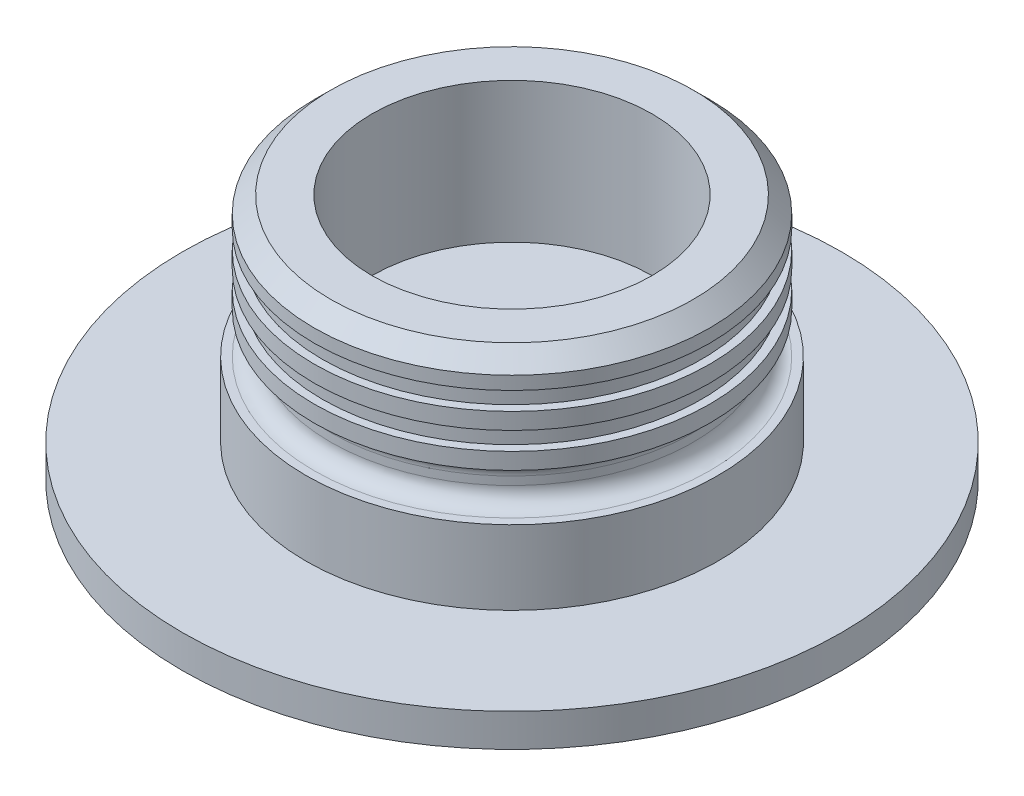
ISO-10303-21;
HEADER;
FILE_DESCRIPTION(('STEP AP214'),'2;1');
FILE_NAME('part.step','',(''),(''),'','','');
FILE_SCHEMA(('AUTOMOTIVE_DESIGN { 1 0 10303 214 1 1 1 1 }'));
ENDSEC;
DATA;
#1=APPLICATION_CONTEXT('core data for automotive mechanical design processes');
#2=APPLICATION_PROTOCOL_DEFINITION('international standard','automotive_design',2000,#1);
#3=PRODUCT_CONTEXT('',#1,'mechanical');
#4=PRODUCT('Part','Part','',(#3));
#5=PRODUCT_RELATED_PRODUCT_CATEGORY('part','',(#4));
#6=PRODUCT_DEFINITION_FORMATION('','',#4);
#7=PRODUCT_DEFINITION_CONTEXT('part definition',#1,'design');
#8=PRODUCT_DEFINITION('design','',#6,#7);
#9=PRODUCT_DEFINITION_SHAPE('','',#8);
#10=(LENGTH_UNIT() NAMED_UNIT(*) SI_UNIT(.MILLI.,.METRE.));
#11=(NAMED_UNIT(*) PLANE_ANGLE_UNIT() SI_UNIT($,.RADIAN.));
#12=(NAMED_UNIT(*) SI_UNIT($,.STERADIAN.) SOLID_ANGLE_UNIT());
#13=UNCERTAINTY_MEASURE_WITH_UNIT(LENGTH_MEASURE(1.E-05),#10,'distance_accuracy_value','');
#14=(GEOMETRIC_REPRESENTATION_CONTEXT(3) GLOBAL_UNCERTAINTY_ASSIGNED_CONTEXT((#13)) GLOBAL_UNIT_ASSIGNED_CONTEXT((#10,
#11,#12)) REPRESENTATION_CONTEXT('',''));
#15=CARTESIAN_POINT('',(0.,0.,0.));
#16=DIRECTION('',(0.,0.,1.));
#17=DIRECTION('',(1.,0.,0.));
#18=AXIS2_PLACEMENT_3D('',#15,#16,#17);
#19=CARTESIAN_POINT('',(0.,30.,0.));
#20=DIRECTION('',(0.,-1.,0.));
#21=DIRECTION('',(0.,0.,-1.));
#22=AXIS2_PLACEMENT_3D('',#19,#20,#21);
#23=CYLINDRICAL_SURFACE('',#22,24.);
#24=CARTESIAN_POINT('',(0.,28.,0.));
#25=DIRECTION('',(0.,1.,0.));
#26=DIRECTION('',(0.,0.,1.));
#27=AXIS2_PLACEMENT_3D('',#24,#25,#26);
#28=CIRCLE('',#27,24.);
#29=CARTESIAN_POINT('',(0.,28.,24.));
#30=VERTEX_POINT('',#29);
#31=EDGE_CURVE('E56',#30,#30,#28,.F.);
#32=ORIENTED_EDGE('',*,*,#31,.T.);
#33=EDGE_LOOP('',(#32));
#34=FACE_BOUND('',#33,.T.);
#35=CARTESIAN_POINT('',(0.,26.4,0.));
#36=DIRECTION('',(0.,-1.,0.));
#37=DIRECTION('',(0.,0.,-1.));
#38=AXIS2_PLACEMENT_3D('',#35,#36,#37);
#39=CIRCLE('',#38,24.);
#40=CARTESIAN_POINT('',(0.,26.4,-24.));
#41=VERTEX_POINT('',#40);
#42=EDGE_CURVE('E101',#41,#41,#39,.T.);
#43=ORIENTED_EDGE('',*,*,#42,.F.);
#44=EDGE_LOOP('',(#43));
#45=FACE_BOUND('',#44,.T.);
#46=ADVANCED_FACE('F41',(#34,#45),#23,.T.);
#47=CARTESIAN_POINT('',(0.,18.,0.));
#48=DIRECTION('',(0.,1.,0.));
#49=DIRECTION('',(0.,0.,1.));
#50=AXIS2_PLACEMENT_3D('',#47,#48,#49);
#51=CIRCLE('',#50,24.);
#52=CARTESIAN_POINT('',(0.,18.,24.));
#53=VERTEX_POINT('',#52);
#54=EDGE_CURVE('E89',#53,#53,#51,.T.);
#55=ORIENTED_EDGE('',*,*,#54,.T.);
#56=EDGE_LOOP('',(#55));
#57=FACE_BOUND('',#56,.T.);
#58=CARTESIAN_POINT('',(0.,20.,0.));
#59=DIRECTION('',(0.,-1.,0.));
#60=DIRECTION('',(0.,0.,-1.));
#61=AXIS2_PLACEMENT_3D('',#58,#59,#60);
#62=CIRCLE('',#61,24.);
#63=CARTESIAN_POINT('',(0.,20.,-24.));
#64=VERTEX_POINT('',#63);
#65=EDGE_CURVE('E98',#64,#64,#62,.T.);
#66=ORIENTED_EDGE('',*,*,#65,.T.);
#67=EDGE_LOOP('',(#66));
#68=FACE_BOUND('',#67,.T.);
#69=ADVANCED_FACE('F126',(#57,#68),#23,.T.);
#70=CARTESIAN_POINT('',(0.,13.,0.));
#71=DIRECTION('',(0.,1.,0.));
#72=DIRECTION('',(0.,0.,1.));
#73=AXIS2_PLACEMENT_3D('',#70,#71,#72);
#74=PLANE('',#73);
#75=CARTESIAN_POINT('',(0.,13.,0.));
#76=DIRECTION('',(0.,1.,0.));
#77=DIRECTION('',(0.,0.,1.));
#78=AXIS2_PLACEMENT_3D('',#75,#76,#77);
#79=CIRCLE('',#78,6.1);
#80=CARTESIAN_POINT('',(0.,13.,6.1));
#81=VERTEX_POINT('',#80);
#82=EDGE_CURVE('E85',#81,#81,#79,.T.);
#83=ORIENTED_EDGE('',*,*,#82,.F.);
#84=EDGE_LOOP('',(#83));
#85=FACE_BOUND('',#84,.T.);
#86=CARTESIAN_POINT('',(0.,13.,0.));
#87=DIRECTION('',(0.,1.,0.));
#88=DIRECTION('',(0.,0.,1.));
#89=AXIS2_PLACEMENT_3D('',#86,#87,#88);
#90=CIRCLE('',#89,17.);
#91=CARTESIAN_POINT('',(0.,13.,17.));
#92=VERTEX_POINT('',#91);
#93=EDGE_CURVE('E64',#92,#92,#90,.F.);
#94=ORIENTED_EDGE('',*,*,#93,.F.);
#95=EDGE_LOOP('',(#94));
#96=FACE_BOUND('',#95,.T.);
#97=ADVANCED_FACE('F133',(#85,#96),#74,.T.);
#98=CARTESIAN_POINT('',(0.,4.,0.));
#99=DIRECTION('',(0.,1.,0.));
#100=DIRECTION('',(0.,0.,1.));
#101=AXIS2_PLACEMENT_3D('',#98,#99,#100);
#102=PLANE('',#101);
#103=CARTESIAN_POINT('',(0.,4.,0.));
#104=DIRECTION('',(0.,1.,0.));
#105=DIRECTION('',(0.,0.,1.));
#106=AXIS2_PLACEMENT_3D('',#103,#104,#105);
#107=CIRCLE('',#106,2.1);
#108=CARTESIAN_POINT('',(0.,4.,2.1));
#109=VERTEX_POINT('',#108);
#110=EDGE_CURVE('E72',#109,#109,#107,.T.);
#111=ORIENTED_EDGE('',*,*,#110,.F.);
#112=EDGE_LOOP('',(#111));
#113=FACE_BOUND('',#112,.T.);
#114=CARTESIAN_POINT('',(0.,4.,0.));
#115=DIRECTION('',(0.,1.,0.));
#116=DIRECTION('',(0.,0.,1.));
#117=AXIS2_PLACEMENT_3D('',#114,#115,#116);
#118=CIRCLE('',#117,6.1);
#119=CARTESIAN_POINT('',(0.,4.,6.1));
#120=VERTEX_POINT('',#119);
#121=EDGE_CURVE('E86',#120,#120,#118,.T.);
#122=ORIENTED_EDGE('',*,*,#121,.T.);
#123=EDGE_LOOP('',(#122));
#124=FACE_BOUND('',#123,.T.);
#125=ADVANCED_FACE('F213',(#113,#124),#102,.T.);
#126=CARTESIAN_POINT('',(0.,4.,0.));
#127=DIRECTION('',(0.,1.,0.));
#128=DIRECTION('',(0.,0.,1.));
#129=AXIS2_PLACEMENT_3D('',#126,#127,#128);
#130=CIRCLE('',#129,25.);
#131=CARTESIAN_POINT('',(0.,4.,25.));
#132=VERTEX_POINT('',#131);
#133=EDGE_CURVE('E67',#132,#132,#130,.T.);
#134=ORIENTED_EDGE('',*,*,#133,.F.);
#135=EDGE_LOOP('',(#134));
#136=FACE_BOUND('',#135,.T.);
#137=CARTESIAN_POINT('',(0.,4.,0.));
#138=DIRECTION('',(0.,1.,0.));
#139=DIRECTION('',(0.,0.,1.));
#140=AXIS2_PLACEMENT_3D('',#137,#138,#139);
#141=CIRCLE('',#140,40.);
#142=CARTESIAN_POINT('',(0.,4.,40.));
#143=VERTEX_POINT('',#142);
#144=EDGE_CURVE('E71',#143,#143,#141,.T.);
#145=ORIENTED_EDGE('',*,*,#144,.T.);
#146=EDGE_LOOP('',(#145));
#147=FACE_BOUND('',#146,.T.);
#148=ADVANCED_FACE('F209',(#136,#147),#102,.T.);
#149=CARTESIAN_POINT('',(0.,0.,0.));
#150=DIRECTION('',(0.,1.,0.));
#151=DIRECTION('',(0.,0.,1.));
#152=AXIS2_PLACEMENT_3D('',#149,#150,#151);
#153=PLANE('',#152);
#154=CARTESIAN_POINT('',(0.,0.,0.));
#155=DIRECTION('',(0.,1.,0.));
#156=DIRECTION('',(0.,0.,1.));
#157=AXIS2_PLACEMENT_3D('',#154,#155,#156);
#158=CIRCLE('',#157,40.);
#159=CARTESIAN_POINT('',(0.,0.,40.));
#160=VERTEX_POINT('',#159);
#161=EDGE_CURVE('E68',#160,#160,#158,.T.);
#162=ORIENTED_EDGE('',*,*,#161,.F.);
#163=EDGE_LOOP('',(#162));
#164=FACE_BOUND('',#163,.T.);
#165=CARTESIAN_POINT('',(0.,0.,0.));
#166=DIRECTION('',(0.,1.,0.));
#167=DIRECTION('',(0.,0.,1.));
#168=AXIS2_PLACEMENT_3D('',#165,#166,#167);
#169=CIRCLE('',#168,2.1);
#170=CARTESIAN_POINT('',(0.,0.,2.1));
#171=VERTEX_POINT('',#170);
#172=EDGE_CURVE('E75',#171,#171,#169,.T.);
#173=ORIENTED_EDGE('',*,*,#172,.T.);
#174=EDGE_LOOP('',(#173));
#175=FACE_BOUND('',#174,.T.);
#176=ADVANCED_FACE('F212',(#164,#175),#153,.F.);
#177=CARTESIAN_POINT('',(0.,4.,0.));
#178=DIRECTION('',(0.,-1.,0.));
#179=DIRECTION('',(0.,0.,-1.));
#180=AXIS2_PLACEMENT_3D('',#177,#178,#179);
#181=CYLINDRICAL_SURFACE('',#180,40.);
#182=ORIENTED_EDGE('',*,*,#144,.F.);
#183=EDGE_LOOP('',(#182));
#184=FACE_BOUND('',#183,.T.);
#185=ORIENTED_EDGE('',*,*,#161,.T.);
#186=EDGE_LOOP('',(#185));
#187=FACE_BOUND('',#186,.T.);
#188=ADVANCED_FACE('F207',(#184,#187),#181,.T.);
#189=CARTESIAN_POINT('',(0.,4.,0.));
#190=DIRECTION('',(0.,-1.,0.));
#191=DIRECTION('',(0.,0.,-1.));
#192=AXIS2_PLACEMENT_3D('',#189,#190,#191);
#193=CYLINDRICAL_SURFACE('',#192,2.1);
#194=ORIENTED_EDGE('',*,*,#110,.T.);
#195=EDGE_LOOP('',(#194));
#196=FACE_BOUND('',#195,.T.);
#197=ORIENTED_EDGE('',*,*,#172,.F.);
#198=EDGE_LOOP('',(#197));
#199=FACE_BOUND('',#198,.T.);
#200=ADVANCED_FACE('F201',(#196,#199),#193,.F.);
#201=CARTESIAN_POINT('',(0.,13.,0.));
#202=DIRECTION('',(0.,1.,0.));
#203=DIRECTION('',(0.,0.,1.));
#204=AXIS2_PLACEMENT_3D('',#201,#202,#203);
#205=CIRCLE('',#204,24.);
#206=CARTESIAN_POINT('',(0.,13.,24.));
#207=VERTEX_POINT('',#206);
#208=EDGE_CURVE('E10',#207,#207,#205,.F.);
#209=ORIENTED_EDGE('',*,*,#208,.T.);
#210=EDGE_LOOP('',(#209));
#211=FACE_BOUND('',#210,.T.);
#212=CARTESIAN_POINT('',(0.,13.,0.));
#213=DIRECTION('',(0.,1.,0.));
#214=DIRECTION('',(0.,0.,1.));
#215=AXIS2_PLACEMENT_3D('',#212,#213,#214);
#216=CIRCLE('',#215,25.);
#217=CARTESIAN_POINT('',(0.,13.,25.));
#218=VERTEX_POINT('',#217);
#219=EDGE_CURVE('E78',#218,#218,#216,.T.);
#220=ORIENTED_EDGE('',*,*,#219,.T.);
#221=EDGE_LOOP('',(#220));
#222=FACE_BOUND('',#221,.T.);
#223=ADVANCED_FACE('F198',(#211,#222),#74,.T.);
#224=CARTESIAN_POINT('',(0.,13.,0.));
#225=DIRECTION('',(0.,-1.,0.));
#226=DIRECTION('',(0.,0.,-1.));
#227=AXIS2_PLACEMENT_3D('',#224,#225,#226);
#228=CYLINDRICAL_SURFACE('',#227,25.);
#229=ORIENTED_EDGE('',*,*,#219,.F.);
#230=EDGE_LOOP('',(#229));
#231=FACE_BOUND('',#230,.T.);
#232=ORIENTED_EDGE('',*,*,#133,.T.);
#233=EDGE_LOOP('',(#232));
#234=FACE_BOUND('',#233,.T.);
#235=ADVANCED_FACE('F196',(#231,#234),#228,.T.);
#236=CARTESIAN_POINT('',(0.,13.,0.));
#237=DIRECTION('',(0.,-1.,0.));
#238=DIRECTION('',(0.,0.,-1.));
#239=AXIS2_PLACEMENT_3D('',#236,#237,#238);
#240=CYLINDRICAL_SURFACE('',#239,6.1);
#241=ORIENTED_EDGE('',*,*,#82,.T.);
#242=EDGE_LOOP('',(#241));
#243=FACE_BOUND('',#242,.T.);
#244=ORIENTED_EDGE('',*,*,#121,.F.);
#245=EDGE_LOOP('',(#244));
#246=FACE_BOUND('',#245,.T.);
#247=ADVANCED_FACE('F191',(#243,#246),#240,.F.);
#248=CARTESIAN_POINT('',(0.,18.,0.));
#249=DIRECTION('',(0.,-1.,0.));
#250=DIRECTION('',(0.,0.,-1.));
#251=AXIS2_PLACEMENT_3D('',#248,#249,#250);
#252=CYLINDRICAL_SURFACE('',#251,22.);
#253=CARTESIAN_POINT('',(0.,15.,0.));
#254=DIRECTION('',(0.,1.,0.));
#255=DIRECTION('',(0.,0.,1.));
#256=AXIS2_PLACEMENT_3D('',#253,#254,#255);
#257=CIRCLE('',#256,22.);
#258=CARTESIAN_POINT('',(0.,15.,22.));
#259=VERTEX_POINT('',#258);
#260=EDGE_CURVE('E48',#259,#259,#257,.T.);
#261=ORIENTED_EDGE('',*,*,#260,.T.);
#262=EDGE_LOOP('',(#261));
#263=FACE_BOUND('',#262,.T.);
#264=CARTESIAN_POINT('',(0.,16.,0.));
#265=DIRECTION('',(0.,1.,0.));
#266=DIRECTION('',(0.,0.,1.));
#267=AXIS2_PLACEMENT_3D('',#264,#265,#266);
#268=CIRCLE('',#267,22.);
#269=CARTESIAN_POINT('',(0.,16.,22.));
#270=VERTEX_POINT('',#269);
#271=EDGE_CURVE('E52',#270,#270,#268,.F.);
#272=ORIENTED_EDGE('',*,*,#271,.T.);
#273=EDGE_LOOP('',(#272));
#274=FACE_BOUND('',#273,.T.);
#275=ADVANCED_FACE('F181',(#263,#274),#252,.T.);
#276=CARTESIAN_POINT('',(0.,18.,0.));
#277=DIRECTION('',(0.,-1.,0.));
#278=DIRECTION('',(0.,0.,-1.));
#279=AXIS2_PLACEMENT_3D('',#276,#277,#278);
#280=CYLINDRICAL_SURFACE('',#279,17.);
#281=ORIENTED_EDGE('',*,*,#93,.T.);
#282=EDGE_LOOP('',(#281));
#283=FACE_BOUND('',#282,.T.);
#284=CARTESIAN_POINT('',(0.,30.,0.));
#285=DIRECTION('',(0.,1.,0.));
#286=DIRECTION('',(0.,0.,1.));
#287=AXIS2_PLACEMENT_3D('',#284,#285,#286);
#288=CIRCLE('',#287,17.);
#289=CARTESIAN_POINT('',(0.,30.,17.));
#290=VERTEX_POINT('',#289);
#291=EDGE_CURVE('E94',#290,#290,#288,.T.);
#292=ORIENTED_EDGE('',*,*,#291,.T.);
#293=EDGE_LOOP('',(#292));
#294=FACE_BOUND('',#293,.T.);
#295=ADVANCED_FACE('F176',(#283,#294),#280,.F.);
#296=CARTESIAN_POINT('',(0.,30.,0.));
#297=DIRECTION('',(0.,1.,0.));
#298=DIRECTION('',(0.,0.,1.));
#299=AXIS2_PLACEMENT_3D('',#296,#297,#298);
#300=PLANE('',#299);
#301=CARTESIAN_POINT('',(0.,30.,0.));
#302=DIRECTION('',(0.,1.,0.));
#303=DIRECTION('',(0.,0.,1.));
#304=AXIS2_PLACEMENT_3D('',#301,#302,#303);
#305=CIRCLE('',#304,22.);
#306=CARTESIAN_POINT('',(0.,30.,22.));
#307=VERTEX_POINT('',#306);
#308=EDGE_CURVE('E61',#307,#307,#305,.T.);
#309=ORIENTED_EDGE('',*,*,#308,.T.);
#310=EDGE_LOOP('',(#309));
#311=FACE_BOUND('',#310,.T.);
#312=ORIENTED_EDGE('',*,*,#291,.F.);
#313=EDGE_LOOP('',(#312));
#314=FACE_BOUND('',#313,.T.);
#315=ADVANCED_FACE('F173',(#311,#314),#300,.T.);
#316=CARTESIAN_POINT('',(0.,20.,24.));
#317=DIRECTION('',(0.,1.,0.));
#318=DIRECTION('',(0.,0.,1.));
#319=AXIS2_PLACEMENT_3D('',#316,#317,#318);
#320=PLANE('',#319);
#321=CARTESIAN_POINT('',(0.,20.,0.));
#322=DIRECTION('',(0.,-1.,0.));
#323=DIRECTION('',(0.,0.,-1.));
#324=AXIS2_PLACEMENT_3D('',#321,#322,#323);
#325=CIRCLE('',#324,23.);
#326=CARTESIAN_POINT('',(0.,20.,-23.));
#327=VERTEX_POINT('',#326);
#328=EDGE_CURVE('E102',#327,#327,#325,.T.);
#329=ORIENTED_EDGE('',*,*,#328,.T.);
#330=EDGE_LOOP('',(#329));
#331=FACE_BOUND('',#330,.T.);
#332=ORIENTED_EDGE('',*,*,#65,.F.);
#333=EDGE_LOOP('',(#332));
#334=FACE_BOUND('',#333,.T.);
#335=ADVANCED_FACE('F170',(#331,#334),#320,.T.);
#336=CARTESIAN_POINT('',(0.,0.,0.));
#337=DIRECTION('',(0.,-1.,0.));
#338=DIRECTION('',(0.,0.,-1.));
#339=AXIS2_PLACEMENT_3D('',#336,#337,#338);
#340=CYLINDRICAL_SURFACE('',#339,23.);
#341=CARTESIAN_POINT('',(0.,22.2,0.));
#342=DIRECTION('',(0.,-1.,0.));
#343=DIRECTION('',(0.,0.,-1.));
#344=AXIS2_PLACEMENT_3D('',#341,#342,#343);
#345=CIRCLE('',#344,23.);
#346=CARTESIAN_POINT('',(0.,22.2,-23.));
#347=VERTEX_POINT('',#346);
#348=EDGE_CURVE('E105',#347,#347,#345,.T.);
#349=ORIENTED_EDGE('',*,*,#348,.T.);
#350=EDGE_LOOP('',(#349));
#351=FACE_BOUND('',#350,.T.);
#352=ORIENTED_EDGE('',*,*,#328,.F.);
#353=EDGE_LOOP('',(#352));
#354=FACE_BOUND('',#353,.T.);
#355=ADVANCED_FACE('F164',(#351,#354),#340,.T.);
#356=CARTESIAN_POINT('',(0.,22.2,24.));
#357=DIRECTION('',(0.,-1.,0.));
#358=DIRECTION('',(0.,0.,-1.));
#359=AXIS2_PLACEMENT_3D('',#356,#357,#358);
#360=PLANE('',#359);
#361=CARTESIAN_POINT('',(0.,22.2,0.));
#362=DIRECTION('',(0.,-1.,0.));
#363=DIRECTION('',(0.,0.,-1.));
#364=AXIS2_PLACEMENT_3D('',#361,#362,#363);
#365=CIRCLE('',#364,24.);
#366=CARTESIAN_POINT('',(0.,22.2,-24.));
#367=VERTEX_POINT('',#366);
#368=EDGE_CURVE('E108',#367,#367,#365,.T.);
#369=ORIENTED_EDGE('',*,*,#368,.T.);
#370=EDGE_LOOP('',(#369));
#371=FACE_BOUND('',#370,.T.);
#372=ORIENTED_EDGE('',*,*,#348,.F.);
#373=EDGE_LOOP('',(#372));
#374=FACE_BOUND('',#373,.T.);
#375=ADVANCED_FACE('F155',(#371,#374),#360,.T.);
#376=CARTESIAN_POINT('',(0.,24.2,24.));
#377=DIRECTION('',(0.,1.,0.));
#378=DIRECTION('',(0.,0.,1.));
#379=AXIS2_PLACEMENT_3D('',#376,#377,#378);
#380=PLANE('',#379);
#381=CARTESIAN_POINT('',(0.,24.2,0.));
#382=DIRECTION('',(0.,-1.,0.));
#383=DIRECTION('',(0.,0.,-1.));
#384=AXIS2_PLACEMENT_3D('',#381,#382,#383);
#385=CIRCLE('',#384,23.);
#386=CARTESIAN_POINT('',(0.,24.2,-23.));
#387=VERTEX_POINT('',#386);
#388=EDGE_CURVE('E113',#387,#387,#385,.T.);
#389=ORIENTED_EDGE('',*,*,#388,.T.);
#390=EDGE_LOOP('',(#389));
#391=FACE_BOUND('',#390,.T.);
#392=CARTESIAN_POINT('',(0.,24.2,0.));
#393=DIRECTION('',(0.,-1.,0.));
#394=DIRECTION('',(0.,0.,-1.));
#395=AXIS2_PLACEMENT_3D('',#392,#393,#394);
#396=CIRCLE('',#395,24.);
#397=CARTESIAN_POINT('',(0.,24.2,-24.));
#398=VERTEX_POINT('',#397);
#399=EDGE_CURVE('E97',#398,#398,#396,.T.);
#400=ORIENTED_EDGE('',*,*,#399,.F.);
#401=EDGE_LOOP('',(#400));
#402=FACE_BOUND('',#401,.T.);
#403=ADVANCED_FACE('F153',(#391,#402),#380,.T.);
#404=CARTESIAN_POINT('',(0.,0.,0.));
#405=DIRECTION('',(0.,-1.,0.));
#406=DIRECTION('',(0.,0.,-1.));
#407=AXIS2_PLACEMENT_3D('',#404,#405,#406);
#408=CYLINDRICAL_SURFACE('',#407,23.);
#409=CARTESIAN_POINT('',(0.,26.4,0.));
#410=DIRECTION('',(0.,-1.,0.));
#411=DIRECTION('',(0.,0.,-1.));
#412=AXIS2_PLACEMENT_3D('',#409,#410,#411);
#413=CIRCLE('',#412,23.);
#414=CARTESIAN_POINT('',(0.,26.4,-23.));
#415=VERTEX_POINT('',#414);
#416=EDGE_CURVE('E116',#415,#415,#413,.T.);
#417=ORIENTED_EDGE('',*,*,#416,.T.);
#418=EDGE_LOOP('',(#417));
#419=FACE_BOUND('',#418,.T.);
#420=ORIENTED_EDGE('',*,*,#388,.F.);
#421=EDGE_LOOP('',(#420));
#422=FACE_BOUND('',#421,.T.);
#423=ADVANCED_FACE('F147',(#419,#422),#408,.T.);
#424=CARTESIAN_POINT('',(0.,26.4,24.));
#425=DIRECTION('',(0.,-1.,0.));
#426=DIRECTION('',(0.,0.,-1.));
#427=AXIS2_PLACEMENT_3D('',#424,#425,#426);
#428=PLANE('',#427);
#429=ORIENTED_EDGE('',*,*,#42,.T.);
#430=EDGE_LOOP('',(#429));
#431=FACE_BOUND('',#430,.T.);
#432=ORIENTED_EDGE('',*,*,#416,.F.);
#433=EDGE_LOOP('',(#432));
#434=FACE_BOUND('',#433,.T.);
#435=ADVANCED_FACE('F122',(#431,#434),#428,.T.);
#436=ORIENTED_EDGE('',*,*,#368,.F.);
#437=EDGE_LOOP('',(#436));
#438=FACE_BOUND('',#437,.T.);
#439=ORIENTED_EDGE('',*,*,#399,.T.);
#440=EDGE_LOOP('',(#439));
#441=FACE_BOUND('',#440,.T.);
#442=ADVANCED_FACE('F129',(#438,#441),#23,.T.);
#443=CARTESIAN_POINT('',(0.,30.,0.));
#444=DIRECTION('',(0.,-1.,0.));
#445=DIRECTION('',(0.,0.,-1.));
#446=AXIS2_PLACEMENT_3D('',#443,#444,#445);
#447=CONICAL_SURFACE('',#446,22.,0.785398163397447);
#448=ORIENTED_EDGE('',*,*,#31,.F.);
#449=EDGE_LOOP('',(#448));
#450=FACE_BOUND('',#449,.T.);
#451=ORIENTED_EDGE('',*,*,#308,.F.);
#452=EDGE_LOOP('',(#451));
#453=FACE_BOUND('',#452,.T.);
#454=ADVANCED_FACE('F138',(#450,#453),#447,.T.);
#455=CARTESIAN_POINT('',(0.,15.,0.));
#456=DIRECTION('',(0.,1.,0.));
#457=DIRECTION('',(0.,0.,1.));
#458=AXIS2_PLACEMENT_3D('',#455,#456,#457);
#459=TOROIDAL_SURFACE('',#458,24.,2.);
#460=ORIENTED_EDGE('',*,*,#208,.F.);
#461=EDGE_LOOP('',(#460));
#462=FACE_BOUND('',#461,.T.);
#463=ORIENTED_EDGE('',*,*,#260,.F.);
#464=EDGE_LOOP('',(#463));
#465=FACE_BOUND('',#464,.T.);
#466=ADVANCED_FACE('F144',(#462,#465),#459,.F.);
#467=CARTESIAN_POINT('',(0.,16.,0.));
#468=DIRECTION('',(0.,1.,0.));
#469=DIRECTION('',(0.,0.,1.));
#470=AXIS2_PLACEMENT_3D('',#467,#468,#469);
#471=TOROIDAL_SURFACE('',#470,24.,2.);
#472=ORIENTED_EDGE('',*,*,#271,.F.);
#473=EDGE_LOOP('',(#472));
#474=FACE_BOUND('',#473,.T.);
#475=ORIENTED_EDGE('',*,*,#54,.F.);
#476=EDGE_LOOP('',(#475));
#477=FACE_BOUND('',#476,.T.);
#478=ADVANCED_FACE('F43',(#474,#477),#471,.F.);
#479=CLOSED_SHELL('',(#46,#69,#97,#125,#148,#176,#188,#200,#223,#235,#247,#275,#295,#315,#335,
#355,#375,#403,#423,#435,#442,#454,#466,#478));
#480=MANIFOLD_SOLID_BREP('B2',#479);
#481=ADVANCED_BREP_SHAPE_REPRESENTATION('',(#18,#480),#14);
#482=SHAPE_DEFINITION_REPRESENTATION(#9,#481);
ENDSEC;
END-ISO-10303-21;
